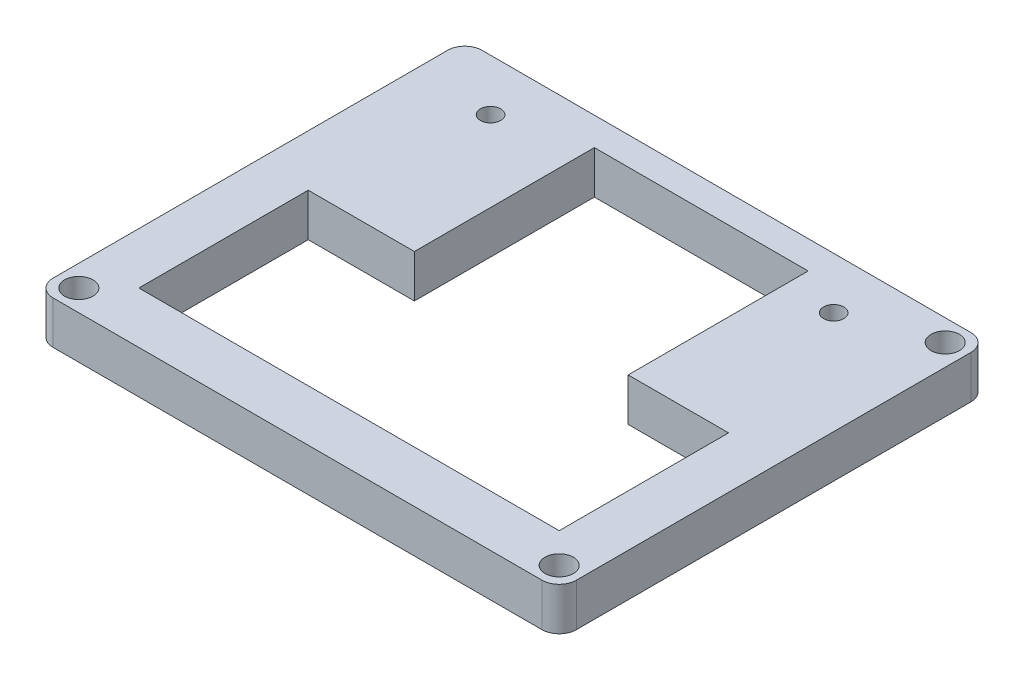
ISO-10303-21;
HEADER;
FILE_DESCRIPTION(('STEP AP214'),'2;1');
FILE_NAME('part.step','',(''),(''),'','','');
FILE_SCHEMA(('AUTOMOTIVE_DESIGN { 1 0 10303 214 1 1 1 1 }'));
ENDSEC;
DATA;
#1=APPLICATION_CONTEXT('core data for automotive mechanical design processes');
#2=APPLICATION_PROTOCOL_DEFINITION('international standard','automotive_design',2000,#1);
#3=PRODUCT_CONTEXT('',#1,'mechanical');
#4=PRODUCT('Part','Part','',(#3));
#5=PRODUCT_RELATED_PRODUCT_CATEGORY('part','',(#4));
#6=PRODUCT_DEFINITION_FORMATION('','',#4);
#7=PRODUCT_DEFINITION_CONTEXT('part definition',#1,'design');
#8=PRODUCT_DEFINITION('design','',#6,#7);
#9=PRODUCT_DEFINITION_SHAPE('','',#8);
#10=(LENGTH_UNIT() NAMED_UNIT(*) SI_UNIT(.MILLI.,.METRE.));
#11=(NAMED_UNIT(*) PLANE_ANGLE_UNIT() SI_UNIT($,.RADIAN.));
#12=(NAMED_UNIT(*) SI_UNIT($,.STERADIAN.) SOLID_ANGLE_UNIT());
#13=UNCERTAINTY_MEASURE_WITH_UNIT(LENGTH_MEASURE(1.E-05),#10,'distance_accuracy_value','');
#14=(GEOMETRIC_REPRESENTATION_CONTEXT(3) GLOBAL_UNCERTAINTY_ASSIGNED_CONTEXT((#13)) GLOBAL_UNIT_ASSIGNED_CONTEXT((#10,
#11,#12)) REPRESENTATION_CONTEXT('',''));
#15=CARTESIAN_POINT('',(0.,0.,0.));
#16=DIRECTION('',(0.,0.,1.));
#17=DIRECTION('',(1.,0.,0.));
#18=AXIS2_PLACEMENT_3D('',#15,#16,#17);
#19=CARTESIAN_POINT('',(0.,6.35,-32.6975405769432));
#20=DIRECTION('',(0.,0.,-1.));
#21=DIRECTION('',(-1.,0.,0.));
#22=AXIS2_PLACEMENT_3D('',#19,#20,#21);
#23=PLANE('',#22);
#24=DIRECTION('',(1.,0.,0.));
#25=VECTOR('',#24,1.);
#26=CARTESIAN_POINT('',(0.,0.,-32.6975405769432));
#27=LINE('',#26,#25);
#28=CARTESIAN_POINT('',(54.9824206554843,0.,-32.6975405769432));
#29=VERTEX_POINT('',#28);
#30=CARTESIAN_POINT('',(69.85,0.,-32.6975405769432));
#31=VERTEX_POINT('',#30);
#32=EDGE_CURVE('E190',#29,#31,#27,.T.);
#33=ORIENTED_EDGE('',*,*,#32,.T.);
#34=DIRECTION('',(0.,-1.,0.));
#35=VECTOR('',#34,1.);
#36=CARTESIAN_POINT('',(69.85,6.35,-32.6975405769432));
#37=LINE('',#36,#35);
#38=CARTESIAN_POINT('',(69.85,6.35,-32.6975405769432));
#39=VERTEX_POINT('',#38);
#40=EDGE_CURVE('E168',#39,#31,#37,.T.);
#41=ORIENTED_EDGE('',*,*,#40,.F.);
#42=DIRECTION('',(1.,0.,0.));
#43=VECTOR('',#42,1.);
#44=CARTESIAN_POINT('',(0.,6.35,-32.6975405769432));
#45=LINE('',#44,#43);
#46=CARTESIAN_POINT('',(54.9824206554843,6.35,-32.6975405769432));
#47=VERTEX_POINT('',#46);
#48=EDGE_CURVE('E176',#47,#39,#45,.T.);
#49=ORIENTED_EDGE('',*,*,#48,.F.);
#50=DIRECTION('',(0.,-1.,0.));
#51=VECTOR('',#50,1.);
#52=CARTESIAN_POINT('',(54.9824206554843,6.35,-32.6975405769432));
#53=LINE('',#52,#51);
#54=EDGE_CURVE('E315',#47,#29,#53,.T.);
#55=ORIENTED_EDGE('',*,*,#54,.T.);
#56=EDGE_LOOP('',(#33,#41,#49,#55));
#57=FACE_BOUND('',#56,.T.);
#58=ADVANCED_FACE('F46',(#57),#23,.F.);
#59=CARTESIAN_POINT('',(69.85,6.35,0.));
#60=DIRECTION('',(1.,0.,0.));
#61=DIRECTION('',(0.,0.,-1.));
#62=AXIS2_PLACEMENT_3D('',#59,#60,#61);
#63=PLANE('',#62);
#64=DIRECTION('',(0.,0.,1.));
#65=VECTOR('',#64,1.);
#66=CARTESIAN_POINT('',(69.85,0.,0.));
#67=LINE('',#66,#65);
#68=CARTESIAN_POINT('',(69.85,0.,-7.62));
#69=VERTEX_POINT('',#68);
#70=EDGE_CURVE('E332',#31,#69,#67,.T.);
#71=ORIENTED_EDGE('',*,*,#70,.T.);
#72=DIRECTION('',(0.,-1.,0.));
#73=VECTOR('',#72,1.);
#74=CARTESIAN_POINT('',(69.85,6.35,-7.62));
#75=LINE('',#74,#73);
#76=CARTESIAN_POINT('',(69.85,6.35,-7.62));
#77=VERTEX_POINT('',#76);
#78=EDGE_CURVE('E170',#77,#69,#75,.T.);
#79=ORIENTED_EDGE('',*,*,#78,.F.);
#80=DIRECTION('',(0.,0.,1.));
#81=VECTOR('',#80,1.);
#82=CARTESIAN_POINT('',(69.85,6.35,0.));
#83=LINE('',#82,#81);
#84=EDGE_CURVE('E163',#39,#77,#83,.T.);
#85=ORIENTED_EDGE('',*,*,#84,.F.);
#86=ORIENTED_EDGE('',*,*,#40,.T.);
#87=EDGE_LOOP('',(#71,#79,#85,#86));
#88=FACE_BOUND('',#87,.T.);
#89=ADVANCED_FACE('F166',(#88),#63,.F.);
#90=CARTESIAN_POINT('',(0.,6.35,-7.62));
#91=DIRECTION('',(0.,0.,-1.));
#92=DIRECTION('',(-1.,0.,0.));
#93=AXIS2_PLACEMENT_3D('',#90,#91,#92);
#94=PLANE('',#93);
#95=DIRECTION('',(1.,0.,0.));
#96=VECTOR('',#95,1.);
#97=CARTESIAN_POINT('',(0.,0.,-7.62));
#98=LINE('',#97,#96);
#99=CARTESIAN_POINT('',(7.62,0.,-7.62));
#100=VERTEX_POINT('',#99);
#101=EDGE_CURVE('E336',#100,#69,#98,.T.);
#102=ORIENTED_EDGE('',*,*,#101,.F.);
#103=DIRECTION('',(0.,-1.,0.));
#104=VECTOR('',#103,1.);
#105=CARTESIAN_POINT('',(7.62,6.35,-7.62));
#106=LINE('',#105,#104);
#107=CARTESIAN_POINT('',(7.62,6.35,-7.62));
#108=VERTEX_POINT('',#107);
#109=EDGE_CURVE('E198',#108,#100,#106,.T.);
#110=ORIENTED_EDGE('',*,*,#109,.F.);
#111=DIRECTION('',(1.,0.,0.));
#112=VECTOR('',#111,1.);
#113=CARTESIAN_POINT('',(0.,6.35,-7.62));
#114=LINE('',#113,#112);
#115=EDGE_CURVE('E175',#108,#77,#114,.T.);
#116=ORIENTED_EDGE('',*,*,#115,.T.);
#117=ORIENTED_EDGE('',*,*,#78,.T.);
#118=EDGE_LOOP('',(#102,#110,#116,#117));
#119=FACE_BOUND('',#118,.T.);
#120=ADVANCED_FACE('F374',(#119),#94,.T.);
#121=CARTESIAN_POINT('',(7.62,6.35,0.));
#122=DIRECTION('',(1.,0.,0.));
#123=DIRECTION('',(0.,0.,-1.));
#124=AXIS2_PLACEMENT_3D('',#121,#122,#123);
#125=PLANE('',#124);
#126=DIRECTION('',(0.,0.,1.));
#127=VECTOR('',#126,1.);
#128=CARTESIAN_POINT('',(7.62,0.,0.));
#129=LINE('',#128,#127);
#130=CARTESIAN_POINT('',(7.62,0.,-32.6975405769432));
#131=VERTEX_POINT('',#130);
#132=EDGE_CURVE('E340',#131,#100,#129,.T.);
#133=ORIENTED_EDGE('',*,*,#132,.F.);
#134=DIRECTION('',(0.,-1.,0.));
#135=VECTOR('',#134,1.);
#136=CARTESIAN_POINT('',(7.62,6.35,-32.6975405769432));
#137=LINE('',#136,#135);
#138=CARTESIAN_POINT('',(7.62,6.35,-32.6975405769432));
#139=VERTEX_POINT('',#138);
#140=EDGE_CURVE('E365',#139,#131,#137,.T.);
#141=ORIENTED_EDGE('',*,*,#140,.F.);
#142=DIRECTION('',(0.,0.,1.));
#143=VECTOR('',#142,1.);
#144=CARTESIAN_POINT('',(7.62,6.35,0.));
#145=LINE('',#144,#143);
#146=EDGE_CURVE('E302',#139,#108,#145,.T.);
#147=ORIENTED_EDGE('',*,*,#146,.T.);
#148=ORIENTED_EDGE('',*,*,#109,.T.);
#149=EDGE_LOOP('',(#133,#141,#147,#148));
#150=FACE_BOUND('',#149,.T.);
#151=ADVANCED_FACE('F371',(#150),#125,.T.);
#152=CARTESIAN_POINT('',(23.3376134601968,0.,-32.6975405769432));
#153=VERTEX_POINT('',#152);
#154=EDGE_CURVE('E333',#131,#153,#27,.T.);
#155=ORIENTED_EDGE('',*,*,#154,.T.);
#156=DIRECTION('',(0.,-1.,0.));
#157=VECTOR('',#156,1.);
#158=CARTESIAN_POINT('',(23.3376134601968,6.35,-32.6975405769432));
#159=LINE('',#158,#157);
#160=CARTESIAN_POINT('',(23.3376134601968,6.35,-32.6975405769432));
#161=VERTEX_POINT('',#160);
#162=EDGE_CURVE('E362',#161,#153,#159,.T.);
#163=ORIENTED_EDGE('',*,*,#162,.F.);
#164=EDGE_CURVE('E188',#139,#161,#45,.T.);
#165=ORIENTED_EDGE('',*,*,#164,.F.);
#166=ORIENTED_EDGE('',*,*,#140,.T.);
#167=EDGE_LOOP('',(#155,#163,#165,#166));
#168=FACE_BOUND('',#167,.T.);
#169=ADVANCED_FACE('F387',(#168),#23,.F.);
#170=CARTESIAN_POINT('',(23.3376134601968,6.35,0.));
#171=DIRECTION('',(1.,0.,0.));
#172=DIRECTION('',(0.,0.,-1.));
#173=AXIS2_PLACEMENT_3D('',#170,#171,#172);
#174=PLANE('',#173);
#175=DIRECTION('',(0.,0.,1.));
#176=VECTOR('',#175,1.);
#177=CARTESIAN_POINT('',(23.3376134601968,0.,0.));
#178=LINE('',#177,#176);
#179=CARTESIAN_POINT('',(23.3376134601968,0.,-59.3441247545589));
#180=VERTEX_POINT('',#179);
#181=EDGE_CURVE('E344',#180,#153,#178,.T.);
#182=ORIENTED_EDGE('',*,*,#181,.F.);
#183=DIRECTION('',(0.,-1.,0.));
#184=VECTOR('',#183,1.);
#185=CARTESIAN_POINT('',(23.3376134601968,6.35,-59.3441247545589));
#186=LINE('',#185,#184);
#187=CARTESIAN_POINT('',(23.3376134601968,6.35,-59.3441247545589));
#188=VERTEX_POINT('',#187);
#189=EDGE_CURVE('E359',#188,#180,#186,.T.);
#190=ORIENTED_EDGE('',*,*,#189,.F.);
#191=DIRECTION('',(0.,0.,1.));
#192=VECTOR('',#191,1.);
#193=CARTESIAN_POINT('',(23.3376134601968,6.35,0.));
#194=LINE('',#193,#192);
#195=EDGE_CURVE('E306',#188,#161,#194,.T.);
#196=ORIENTED_EDGE('',*,*,#195,.T.);
#197=ORIENTED_EDGE('',*,*,#162,.T.);
#198=EDGE_LOOP('',(#182,#190,#196,#197));
#199=FACE_BOUND('',#198,.T.);
#200=ADVANCED_FACE('F389',(#199),#174,.T.);
#201=CARTESIAN_POINT('',(0.,6.35,-59.3441247545589));
#202=DIRECTION('',(0.,0.,-1.));
#203=DIRECTION('',(-1.,0.,0.));
#204=AXIS2_PLACEMENT_3D('',#201,#202,#203);
#205=PLANE('',#204);
#206=DIRECTION('',(1.,0.,0.));
#207=VECTOR('',#206,1.);
#208=CARTESIAN_POINT('',(0.,0.,-59.3441247545589));
#209=LINE('',#208,#207);
#210=CARTESIAN_POINT('',(54.9824206554843,0.,-59.3441247545589));
#211=VERTEX_POINT('',#210);
#212=EDGE_CURVE('E348',#180,#211,#209,.T.);
#213=ORIENTED_EDGE('',*,*,#212,.T.);
#214=DIRECTION('',(0.,-1.,0.));
#215=VECTOR('',#214,1.);
#216=CARTESIAN_POINT('',(54.9824206554843,6.35,-59.3441247545589));
#217=LINE('',#216,#215);
#218=CARTESIAN_POINT('',(54.9824206554843,6.35,-59.3441247545589));
#219=VERTEX_POINT('',#218);
#220=EDGE_CURVE('E355',#219,#211,#217,.T.);
#221=ORIENTED_EDGE('',*,*,#220,.F.);
#222=DIRECTION('',(1.,0.,0.));
#223=VECTOR('',#222,1.);
#224=CARTESIAN_POINT('',(0.,6.35,-59.3441247545589));
#225=LINE('',#224,#223);
#226=EDGE_CURVE('E310',#188,#219,#225,.T.);
#227=ORIENTED_EDGE('',*,*,#226,.F.);
#228=ORIENTED_EDGE('',*,*,#189,.T.);
#229=EDGE_LOOP('',(#213,#221,#227,#228));
#230=FACE_BOUND('',#229,.T.);
#231=ADVANCED_FACE('F393',(#230),#205,.F.);
#232=CARTESIAN_POINT('',(0.,6.35,0.));
#233=DIRECTION('',(0.,0.,-1.));
#234=DIRECTION('',(-1.,0.,0.));
#235=AXIS2_PLACEMENT_3D('',#232,#233,#234);
#236=PLANE('',#235);
#237=DIRECTION('',(1.,0.,0.));
#238=VECTOR('',#237,1.);
#239=CARTESIAN_POINT('',(0.,0.,0.));
#240=LINE('',#239,#238);
#241=CARTESIAN_POINT('',(2.54,0.,0.));
#242=VERTEX_POINT('',#241);
#243=CARTESIAN_POINT('',(74.93,0.,0.));
#244=VERTEX_POINT('',#243);
#245=EDGE_CURVE('E266',#242,#244,#240,.T.);
#246=ORIENTED_EDGE('',*,*,#245,.T.);
#247=DIRECTION('',(0.,-1.,0.));
#248=VECTOR('',#247,1.);
#249=CARTESIAN_POINT('',(74.93,6.35,0.));
#250=LINE('',#249,#248);
#251=CARTESIAN_POINT('',(74.93,6.35,0.));
#252=VERTEX_POINT('',#251);
#253=EDGE_CURVE('E11',#244,#252,#250,.F.);
#254=ORIENTED_EDGE('',*,*,#253,.T.);
#255=DIRECTION('',(1.,0.,0.));
#256=VECTOR('',#255,1.);
#257=CARTESIAN_POINT('',(0.,6.35,0.));
#258=LINE('',#257,#256);
#259=CARTESIAN_POINT('',(2.54,6.35,0.));
#260=VERTEX_POINT('',#259);
#261=EDGE_CURVE('E286',#260,#252,#258,.T.);
#262=ORIENTED_EDGE('',*,*,#261,.F.);
#263=DIRECTION('',(0.,-1.,0.));
#264=VECTOR('',#263,1.);
#265=CARTESIAN_POINT('',(2.54,0.,0.));
#266=LINE('',#265,#264);
#267=EDGE_CURVE('E56',#260,#242,#266,.T.);
#268=ORIENTED_EDGE('',*,*,#267,.T.);
#269=EDGE_LOOP('',(#246,#254,#262,#268));
#270=FACE_BOUND('',#269,.T.);
#271=ADVANCED_FACE('F437',(#270),#236,.F.);
#272=CARTESIAN_POINT('',(77.47,6.35,0.));
#273=DIRECTION('',(-1.,0.,0.));
#274=DIRECTION('',(0.,0.,1.));
#275=AXIS2_PLACEMENT_3D('',#272,#273,#274);
#276=PLANE('',#275);
#277=DIRECTION('',(0.,0.,-1.));
#278=VECTOR('',#277,1.);
#279=CARTESIAN_POINT('',(77.47,0.,0.));
#280=LINE('',#279,#278);
#281=CARTESIAN_POINT('',(77.47,0.,-2.54));
#282=VERTEX_POINT('',#281);
#283=CARTESIAN_POINT('',(77.47,0.,-60.96));
#284=VERTEX_POINT('',#283);
#285=EDGE_CURVE('E319',#282,#284,#280,.T.);
#286=ORIENTED_EDGE('',*,*,#285,.T.);
#287=DIRECTION('',(0.,-1.,0.));
#288=VECTOR('',#287,1.);
#289=CARTESIAN_POINT('',(77.47,6.35,-60.96));
#290=LINE('',#289,#288);
#291=CARTESIAN_POINT('',(77.47,6.35,-60.96));
#292=VERTEX_POINT('',#291);
#293=EDGE_CURVE('E64',#284,#292,#290,.F.);
#294=ORIENTED_EDGE('',*,*,#293,.T.);
#295=DIRECTION('',(0.,0.,-1.));
#296=VECTOR('',#295,1.);
#297=CARTESIAN_POINT('',(77.47,6.35,0.));
#298=LINE('',#297,#296);
#299=CARTESIAN_POINT('',(77.47,6.35,-2.54));
#300=VERTEX_POINT('',#299);
#301=EDGE_CURVE('E289',#300,#292,#298,.T.);
#302=ORIENTED_EDGE('',*,*,#301,.F.);
#303=DIRECTION('',(0.,-1.,0.));
#304=VECTOR('',#303,1.);
#305=CARTESIAN_POINT('',(77.47,6.35,-2.54));
#306=LINE('',#305,#304);
#307=EDGE_CURVE('E235',#300,#282,#306,.T.);
#308=ORIENTED_EDGE('',*,*,#307,.T.);
#309=EDGE_LOOP('',(#286,#294,#302,#308));
#310=FACE_BOUND('',#309,.T.);
#311=ADVANCED_FACE('F433',(#310),#276,.F.);
#312=CARTESIAN_POINT('',(0.,6.35,-63.5));
#313=DIRECTION('',(0.,0.,-1.));
#314=DIRECTION('',(-1.,0.,0.));
#315=AXIS2_PLACEMENT_3D('',#312,#313,#314);
#316=PLANE('',#315);
#317=DIRECTION('',(1.,0.,0.));
#318=VECTOR('',#317,1.);
#319=CARTESIAN_POINT('',(0.,0.,-63.5));
#320=LINE('',#319,#318);
#321=CARTESIAN_POINT('',(2.54,0.,-63.5));
#322=VERTEX_POINT('',#321);
#323=CARTESIAN_POINT('',(74.93,0.,-63.5));
#324=VERTEX_POINT('',#323);
#325=EDGE_CURVE('E322',#322,#324,#320,.T.);
#326=ORIENTED_EDGE('',*,*,#325,.F.);
#327=DIRECTION('',(0.,-1.,0.));
#328=VECTOR('',#327,1.);
#329=CARTESIAN_POINT('',(2.54,6.35,-63.5));
#330=LINE('',#329,#328);
#331=CARTESIAN_POINT('',(2.54,6.35,-63.5));
#332=VERTEX_POINT('',#331);
#333=EDGE_CURVE('E221',#322,#332,#330,.F.);
#334=ORIENTED_EDGE('',*,*,#333,.T.);
#335=DIRECTION('',(1.,0.,0.));
#336=VECTOR('',#335,1.);
#337=CARTESIAN_POINT('',(0.,6.35,-63.5));
#338=LINE('',#337,#336);
#339=CARTESIAN_POINT('',(74.93,6.35,-63.5));
#340=VERTEX_POINT('',#339);
#341=EDGE_CURVE('E293',#332,#340,#338,.T.);
#342=ORIENTED_EDGE('',*,*,#341,.T.);
#343=DIRECTION('',(0.,-1.,0.));
#344=VECTOR('',#343,1.);
#345=CARTESIAN_POINT('',(74.93,0.,-63.5));
#346=LINE('',#345,#344);
#347=EDGE_CURVE('E217',#340,#324,#346,.T.);
#348=ORIENTED_EDGE('',*,*,#347,.T.);
#349=EDGE_LOOP('',(#326,#334,#342,#348));
#350=FACE_BOUND('',#349,.T.);
#351=ADVANCED_FACE('F408',(#350),#316,.T.);
#352=CARTESIAN_POINT('',(0.,6.35,0.));
#353=DIRECTION('',(-1.,0.,0.));
#354=DIRECTION('',(0.,0.,1.));
#355=AXIS2_PLACEMENT_3D('',#352,#353,#354);
#356=PLANE('',#355);
#357=DIRECTION('',(0.,0.,-1.));
#358=VECTOR('',#357,1.);
#359=CARTESIAN_POINT('',(0.,6.35,0.));
#360=LINE('',#359,#358);
#361=CARTESIAN_POINT('',(0.,6.35,-2.54));
#362=VERTEX_POINT('',#361);
#363=CARTESIAN_POINT('',(0.,6.35,-60.96));
#364=VERTEX_POINT('',#363);
#365=EDGE_CURVE('E186',#362,#364,#360,.T.);
#366=ORIENTED_EDGE('',*,*,#365,.T.);
#367=DIRECTION('',(0.,-1.,0.));
#368=VECTOR('',#367,1.);
#369=CARTESIAN_POINT('',(0.,6.35,-60.96));
#370=LINE('',#369,#368);
#371=CARTESIAN_POINT('',(0.,0.,-60.96));
#372=VERTEX_POINT('',#371);
#373=EDGE_CURVE('E196',#364,#372,#370,.T.);
#374=ORIENTED_EDGE('',*,*,#373,.T.);
#375=DIRECTION('',(0.,0.,-1.));
#376=VECTOR('',#375,1.);
#377=CARTESIAN_POINT('',(0.,0.,0.));
#378=LINE('',#377,#376);
#379=CARTESIAN_POINT('',(0.,0.,-2.54));
#380=VERTEX_POINT('',#379);
#381=EDGE_CURVE('E326',#380,#372,#378,.T.);
#382=ORIENTED_EDGE('',*,*,#381,.F.);
#383=DIRECTION('',(0.,-1.,0.));
#384=VECTOR('',#383,1.);
#385=CARTESIAN_POINT('',(0.,6.35,-2.54));
#386=LINE('',#385,#384);
#387=EDGE_CURVE('E192',#380,#362,#386,.F.);
#388=ORIENTED_EDGE('',*,*,#387,.T.);
#389=EDGE_LOOP('',(#366,#374,#382,#388));
#390=FACE_BOUND('',#389,.T.);
#391=ADVANCED_FACE('F398',(#390),#356,.T.);
#392=CARTESIAN_POINT('',(54.9824206554843,6.35,0.));
#393=DIRECTION('',(1.,0.,0.));
#394=DIRECTION('',(0.,0.,-1.));
#395=AXIS2_PLACEMENT_3D('',#392,#393,#394);
#396=PLANE('',#395);
#397=DIRECTION('',(0.,0.,1.));
#398=VECTOR('',#397,1.);
#399=CARTESIAN_POINT('',(54.9824206554843,0.,0.));
#400=LINE('',#399,#398);
#401=EDGE_CURVE('E290',#211,#29,#400,.T.);
#402=ORIENTED_EDGE('',*,*,#401,.T.);
#403=ORIENTED_EDGE('',*,*,#54,.F.);
#404=DIRECTION('',(0.,0.,1.));
#405=VECTOR('',#404,1.);
#406=CARTESIAN_POINT('',(54.9824206554843,6.35,0.));
#407=LINE('',#406,#405);
#408=EDGE_CURVE('E181',#219,#47,#407,.T.);
#409=ORIENTED_EDGE('',*,*,#408,.F.);
#410=ORIENTED_EDGE('',*,*,#220,.T.);
#411=EDGE_LOOP('',(#402,#403,#409,#410));
#412=FACE_BOUND('',#411,.T.);
#413=ADVANCED_FACE('F396',(#412),#396,.F.);
#414=CARTESIAN_POINT('',(0.,6.35,0.));
#415=DIRECTION('',(0.,1.,0.));
#416=DIRECTION('',(0.,0.,1.));
#417=AXIS2_PLACEMENT_3D('',#414,#415,#416);
#418=PLANE('',#417);
#419=CARTESIAN_POINT('',(11.43,6.35,-55.88));
#420=DIRECTION('',(0.,1.,0.));
#421=DIRECTION('',(0.,0.,1.));
#422=AXIS2_PLACEMENT_3D('',#419,#420,#421);
#423=CIRCLE('',#422,1.5);
#424=CARTESIAN_POINT('',(11.43,6.35,-54.38));
#425=VERTEX_POINT('',#424);
#426=EDGE_CURVE('E246',#425,#425,#423,.T.);
#427=ORIENTED_EDGE('',*,*,#426,.F.);
#428=EDGE_LOOP('',(#427));
#429=FACE_BOUND('',#428,.T.);
#430=CARTESIAN_POINT('',(62.23,6.35,-55.88));
#431=DIRECTION('',(0.,1.,0.));
#432=DIRECTION('',(0.,0.,1.));
#433=AXIS2_PLACEMENT_3D('',#430,#431,#432);
#434=CIRCLE('',#433,1.5);
#435=CARTESIAN_POINT('',(62.23,6.35,-54.38));
#436=VERTEX_POINT('',#435);
#437=EDGE_CURVE('E254',#436,#436,#434,.T.);
#438=ORIENTED_EDGE('',*,*,#437,.F.);
#439=EDGE_LOOP('',(#438));
#440=FACE_BOUND('',#439,.T.);
#441=CARTESIAN_POINT('',(3.175,6.35,-3.175));
#442=DIRECTION('',(0.,1.,0.));
#443=DIRECTION('',(0.,0.,1.));
#444=AXIS2_PLACEMENT_3D('',#441,#442,#443);
#445=CIRCLE('',#444,2.1);
#446=CARTESIAN_POINT('',(3.175,6.35,-1.075));
#447=VERTEX_POINT('',#446);
#448=EDGE_CURVE('E267',#447,#447,#445,.T.);
#449=ORIENTED_EDGE('',*,*,#448,.F.);
#450=EDGE_LOOP('',(#449));
#451=FACE_BOUND('',#450,.T.);
#452=CARTESIAN_POINT('',(74.295,6.35,-3.175));
#453=DIRECTION('',(0.,1.,0.));
#454=DIRECTION('',(0.,0.,1.));
#455=AXIS2_PLACEMENT_3D('',#452,#453,#454);
#456=CIRCLE('',#455,2.1);
#457=CARTESIAN_POINT('',(74.295,6.35,-1.075));
#458=VERTEX_POINT('',#457);
#459=EDGE_CURVE('E271',#458,#458,#456,.T.);
#460=ORIENTED_EDGE('',*,*,#459,.F.);
#461=EDGE_LOOP('',(#460));
#462=FACE_BOUND('',#461,.T.);
#463=CARTESIAN_POINT('',(74.295,6.35,-60.325));
#464=DIRECTION('',(0.,1.,0.));
#465=DIRECTION('',(0.,0.,1.));
#466=AXIS2_PLACEMENT_3D('',#463,#464,#465);
#467=CIRCLE('',#466,2.09999999999999);
#468=CARTESIAN_POINT('',(74.295,6.35,-58.225));
#469=VERTEX_POINT('',#468);
#470=EDGE_CURVE('E279',#469,#469,#467,.T.);
#471=ORIENTED_EDGE('',*,*,#470,.F.);
#472=EDGE_LOOP('',(#471));
#473=FACE_BOUND('',#472,.T.);
#474=ORIENTED_EDGE('',*,*,#341,.F.);
#475=CARTESIAN_POINT('',(2.54,6.35,-60.96));
#476=DIRECTION('',(0.,1.,0.));
#477=DIRECTION('',(0.,0.,1.));
#478=AXIS2_PLACEMENT_3D('',#475,#476,#477);
#479=CIRCLE('',#478,2.54);
#480=EDGE_CURVE('E232',#332,#364,#479,.T.);
#481=ORIENTED_EDGE('',*,*,#480,.T.);
#482=ORIENTED_EDGE('',*,*,#365,.F.);
#483=CARTESIAN_POINT('',(2.54,6.35,-2.54));
#484=DIRECTION('',(0.,1.,0.));
#485=DIRECTION('',(0.,0.,1.));
#486=AXIS2_PLACEMENT_3D('',#483,#484,#485);
#487=CIRCLE('',#486,2.54);
#488=EDGE_CURVE('E224',#362,#260,#487,.T.);
#489=ORIENTED_EDGE('',*,*,#488,.T.);
#490=ORIENTED_EDGE('',*,*,#261,.T.);
#491=CARTESIAN_POINT('',(74.93,6.35,-2.54));
#492=DIRECTION('',(0.,1.,0.));
#493=DIRECTION('',(0.,0.,1.));
#494=AXIS2_PLACEMENT_3D('',#491,#492,#493);
#495=CIRCLE('',#494,2.54);
#496=EDGE_CURVE('E71',#252,#300,#495,.T.);
#497=ORIENTED_EDGE('',*,*,#496,.T.);
#498=ORIENTED_EDGE('',*,*,#301,.T.);
#499=CARTESIAN_POINT('',(74.93,6.35,-60.96));
#500=DIRECTION('',(0.,1.,0.));
#501=DIRECTION('',(0.,0.,1.));
#502=AXIS2_PLACEMENT_3D('',#499,#500,#501);
#503=CIRCLE('',#502,2.54);
#504=EDGE_CURVE('E229',#292,#340,#503,.T.);
#505=ORIENTED_EDGE('',*,*,#504,.T.);
#506=EDGE_LOOP('',(#474,#481,#482,#489,#490,#497,#498,#505));
#507=FACE_BOUND('',#506,.T.);
#508=ORIENTED_EDGE('',*,*,#48,.T.);
#509=ORIENTED_EDGE('',*,*,#84,.T.);
#510=ORIENTED_EDGE('',*,*,#115,.F.);
#511=ORIENTED_EDGE('',*,*,#146,.F.);
#512=ORIENTED_EDGE('',*,*,#164,.T.);
#513=ORIENTED_EDGE('',*,*,#195,.F.);
#514=ORIENTED_EDGE('',*,*,#226,.T.);
#515=ORIENTED_EDGE('',*,*,#408,.T.);
#516=EDGE_LOOP('',(#508,#509,#510,#511,#512,#513,#514,#515));
#517=FACE_BOUND('',#516,.T.);
#518=ADVANCED_FACE('F179',(#429,#440,#451,#462,#473,#507,#517),#418,.T.);
#519=CARTESIAN_POINT('',(0.,0.,0.));
#520=DIRECTION('',(0.,1.,0.));
#521=DIRECTION('',(0.,0.,1.));
#522=AXIS2_PLACEMENT_3D('',#519,#520,#521);
#523=PLANE('',#522);
#524=CARTESIAN_POINT('',(11.43,0.,-55.88));
#525=DIRECTION('',(0.,1.,0.));
#526=DIRECTION('',(0.,0.,1.));
#527=AXIS2_PLACEMENT_3D('',#524,#525,#526);
#528=CIRCLE('',#527,1.5);
#529=CARTESIAN_POINT('',(11.43,0.,-54.38));
#530=VERTEX_POINT('',#529);
#531=EDGE_CURVE('E50',#530,#530,#528,.T.);
#532=ORIENTED_EDGE('',*,*,#531,.T.);
#533=EDGE_LOOP('',(#532));
#534=FACE_BOUND('',#533,.T.);
#535=CARTESIAN_POINT('',(62.23,0.,-55.88));
#536=DIRECTION('',(0.,1.,0.));
#537=DIRECTION('',(0.,0.,1.));
#538=AXIS2_PLACEMENT_3D('',#535,#536,#537);
#539=CIRCLE('',#538,1.5);
#540=CARTESIAN_POINT('',(62.23,0.,-54.38));
#541=VERTEX_POINT('',#540);
#542=EDGE_CURVE('E243',#541,#541,#539,.T.);
#543=ORIENTED_EDGE('',*,*,#542,.T.);
#544=EDGE_LOOP('',(#543));
#545=FACE_BOUND('',#544,.T.);
#546=CARTESIAN_POINT('',(3.175,0.,-3.175));
#547=DIRECTION('',(0.,1.,0.));
#548=DIRECTION('',(0.,0.,1.));
#549=AXIS2_PLACEMENT_3D('',#546,#547,#548);
#550=CIRCLE('',#549,2.1);
#551=CARTESIAN_POINT('',(3.175,0.,-1.075));
#552=VERTEX_POINT('',#551);
#553=EDGE_CURVE('E262',#552,#552,#550,.T.);
#554=ORIENTED_EDGE('',*,*,#553,.T.);
#555=EDGE_LOOP('',(#554));
#556=FACE_BOUND('',#555,.T.);
#557=CARTESIAN_POINT('',(74.295,0.,-3.175));
#558=DIRECTION('',(0.,1.,0.));
#559=DIRECTION('',(0.,0.,1.));
#560=AXIS2_PLACEMENT_3D('',#557,#558,#559);
#561=CIRCLE('',#560,2.1);
#562=CARTESIAN_POINT('',(74.295,0.,-1.075));
#563=VERTEX_POINT('',#562);
#564=EDGE_CURVE('E275',#563,#563,#561,.T.);
#565=ORIENTED_EDGE('',*,*,#564,.T.);
#566=EDGE_LOOP('',(#565));
#567=FACE_BOUND('',#566,.T.);
#568=CARTESIAN_POINT('',(74.295,0.,-60.325));
#569=DIRECTION('',(0.,1.,0.));
#570=DIRECTION('',(0.,0.,1.));
#571=AXIS2_PLACEMENT_3D('',#568,#569,#570);
#572=CIRCLE('',#571,2.09999999999999);
#573=CARTESIAN_POINT('',(74.295,0.,-58.225));
#574=VERTEX_POINT('',#573);
#575=EDGE_CURVE('E252',#574,#574,#572,.T.);
#576=ORIENTED_EDGE('',*,*,#575,.T.);
#577=EDGE_LOOP('',(#576));
#578=FACE_BOUND('',#577,.T.);
#579=ORIENTED_EDGE('',*,*,#381,.T.);
#580=CARTESIAN_POINT('',(2.54,0.,-60.96));
#581=DIRECTION('',(0.,1.,0.));
#582=DIRECTION('',(0.,0.,1.));
#583=AXIS2_PLACEMENT_3D('',#580,#581,#582);
#584=CIRCLE('',#583,2.54);
#585=EDGE_CURVE('E214',#372,#322,#584,.F.);
#586=ORIENTED_EDGE('',*,*,#585,.T.);
#587=ORIENTED_EDGE('',*,*,#325,.T.);
#588=CARTESIAN_POINT('',(74.93,0.,-60.96));
#589=DIRECTION('',(0.,1.,0.));
#590=DIRECTION('',(0.,0.,1.));
#591=AXIS2_PLACEMENT_3D('',#588,#589,#590);
#592=CIRCLE('',#591,2.54);
#593=EDGE_CURVE('E211',#324,#284,#592,.F.);
#594=ORIENTED_EDGE('',*,*,#593,.T.);
#595=ORIENTED_EDGE('',*,*,#285,.F.);
#596=CARTESIAN_POINT('',(74.93,0.,-2.54));
#597=DIRECTION('',(0.,1.,0.));
#598=DIRECTION('',(0.,0.,1.));
#599=AXIS2_PLACEMENT_3D('',#596,#597,#598);
#600=CIRCLE('',#599,2.54);
#601=EDGE_CURVE('E208',#282,#244,#600,.F.);
#602=ORIENTED_EDGE('',*,*,#601,.T.);
#603=ORIENTED_EDGE('',*,*,#245,.F.);
#604=CARTESIAN_POINT('',(2.54,0.,-2.54));
#605=DIRECTION('',(0.,1.,0.));
#606=DIRECTION('',(0.,0.,1.));
#607=AXIS2_PLACEMENT_3D('',#604,#605,#606);
#608=CIRCLE('',#607,2.54);
#609=EDGE_CURVE('E205',#242,#380,#608,.F.);
#610=ORIENTED_EDGE('',*,*,#609,.T.);
#611=EDGE_LOOP('',(#579,#586,#587,#594,#595,#602,#603,#610));
#612=FACE_BOUND('',#611,.T.);
#613=ORIENTED_EDGE('',*,*,#32,.F.);
#614=ORIENTED_EDGE('',*,*,#401,.F.);
#615=ORIENTED_EDGE('',*,*,#212,.F.);
#616=ORIENTED_EDGE('',*,*,#181,.T.);
#617=ORIENTED_EDGE('',*,*,#154,.F.);
#618=ORIENTED_EDGE('',*,*,#132,.T.);
#619=ORIENTED_EDGE('',*,*,#101,.T.);
#620=ORIENTED_EDGE('',*,*,#70,.F.);
#621=EDGE_LOOP('',(#613,#614,#615,#616,#617,#618,#619,#620));
#622=FACE_BOUND('',#621,.T.);
#623=ADVANCED_FACE('F377',(#534,#545,#556,#567,#578,#612,#622),#523,.F.);
#624=CARTESIAN_POINT('',(74.295,0.,-60.325));
#625=DIRECTION('',(0.,1.,0.));
#626=DIRECTION('',(0.,0.,1.));
#627=AXIS2_PLACEMENT_3D('',#624,#625,#626);
#628=CYLINDRICAL_SURFACE('',#627,2.09999999999999);
#629=ORIENTED_EDGE('',*,*,#575,.F.);
#630=EDGE_LOOP('',(#629));
#631=FACE_BOUND('',#630,.T.);
#632=ORIENTED_EDGE('',*,*,#470,.T.);
#633=EDGE_LOOP('',(#632));
#634=FACE_BOUND('',#633,.T.);
#635=ADVANCED_FACE('F476',(#631,#634),#628,.F.);
#636=CARTESIAN_POINT('',(74.295,0.,-3.175));
#637=DIRECTION('',(0.,1.,0.));
#638=DIRECTION('',(0.,0.,1.));
#639=AXIS2_PLACEMENT_3D('',#636,#637,#638);
#640=CYLINDRICAL_SURFACE('',#639,2.1);
#641=ORIENTED_EDGE('',*,*,#564,.F.);
#642=EDGE_LOOP('',(#641));
#643=FACE_BOUND('',#642,.T.);
#644=ORIENTED_EDGE('',*,*,#459,.T.);
#645=EDGE_LOOP('',(#644));
#646=FACE_BOUND('',#645,.T.);
#647=ADVANCED_FACE('F481',(#643,#646),#640,.F.);
#648=CARTESIAN_POINT('',(3.175,0.,-3.175));
#649=DIRECTION('',(0.,1.,0.));
#650=DIRECTION('',(0.,0.,1.));
#651=AXIS2_PLACEMENT_3D('',#648,#649,#650);
#652=CYLINDRICAL_SURFACE('',#651,2.1);
#653=ORIENTED_EDGE('',*,*,#553,.F.);
#654=EDGE_LOOP('',(#653));
#655=FACE_BOUND('',#654,.T.);
#656=ORIENTED_EDGE('',*,*,#448,.T.);
#657=EDGE_LOOP('',(#656));
#658=FACE_BOUND('',#657,.T.);
#659=ADVANCED_FACE('F445',(#655,#658),#652,.F.);
#660=CARTESIAN_POINT('',(2.54,6.35,-60.96));
#661=DIRECTION('',(0.,-1.,0.));
#662=DIRECTION('',(0.,0.,-1.));
#663=AXIS2_PLACEMENT_3D('',#660,#661,#662);
#664=CYLINDRICAL_SURFACE('',#663,2.54);
#665=ORIENTED_EDGE('',*,*,#480,.F.);
#666=ORIENTED_EDGE('',*,*,#333,.F.);
#667=ORIENTED_EDGE('',*,*,#585,.F.);
#668=ORIENTED_EDGE('',*,*,#373,.F.);
#669=EDGE_LOOP('',(#665,#666,#667,#668));
#670=FACE_BOUND('',#669,.T.);
#671=ADVANCED_FACE('F441',(#670),#664,.T.);
#672=CARTESIAN_POINT('',(74.93,6.35,-60.96));
#673=DIRECTION('',(0.,1.,0.));
#674=DIRECTION('',(0.,0.,1.));
#675=AXIS2_PLACEMENT_3D('',#672,#673,#674);
#676=CYLINDRICAL_SURFACE('',#675,2.54);
#677=ORIENTED_EDGE('',*,*,#504,.F.);
#678=ORIENTED_EDGE('',*,*,#293,.F.);
#679=ORIENTED_EDGE('',*,*,#593,.F.);
#680=ORIENTED_EDGE('',*,*,#347,.F.);
#681=EDGE_LOOP('',(#677,#678,#679,#680));
#682=FACE_BOUND('',#681,.T.);
#683=ADVANCED_FACE('F444',(#682),#676,.T.);
#684=CARTESIAN_POINT('',(74.93,6.35,-2.54));
#685=DIRECTION('',(0.,-1.,0.));
#686=DIRECTION('',(0.,0.,-1.));
#687=AXIS2_PLACEMENT_3D('',#684,#685,#686);
#688=CYLINDRICAL_SURFACE('',#687,2.54);
#689=ORIENTED_EDGE('',*,*,#496,.F.);
#690=ORIENTED_EDGE('',*,*,#253,.F.);
#691=ORIENTED_EDGE('',*,*,#601,.F.);
#692=ORIENTED_EDGE('',*,*,#307,.F.);
#693=EDGE_LOOP('',(#689,#690,#691,#692));
#694=FACE_BOUND('',#693,.T.);
#695=ADVANCED_FACE('F448',(#694),#688,.T.);
#696=CARTESIAN_POINT('',(2.54,6.35,-2.54));
#697=DIRECTION('',(0.,1.,0.));
#698=DIRECTION('',(0.,0.,1.));
#699=AXIS2_PLACEMENT_3D('',#696,#697,#698);
#700=CYLINDRICAL_SURFACE('',#699,2.54);
#701=ORIENTED_EDGE('',*,*,#488,.F.);
#702=ORIENTED_EDGE('',*,*,#387,.F.);
#703=ORIENTED_EDGE('',*,*,#609,.F.);
#704=ORIENTED_EDGE('',*,*,#267,.F.);
#705=EDGE_LOOP('',(#701,#702,#703,#704));
#706=FACE_BOUND('',#705,.T.);
#707=ADVANCED_FACE('F48',(#706),#700,.T.);
#708=CARTESIAN_POINT('',(62.23,-3.81,-55.88));
#709=DIRECTION('',(0.,1.,0.));
#710=DIRECTION('',(0.,0.,1.));
#711=AXIS2_PLACEMENT_3D('',#708,#709,#710);
#712=CYLINDRICAL_SURFACE('',#711,1.5);
#713=ORIENTED_EDGE('',*,*,#437,.T.);
#714=EDGE_LOOP('',(#713));
#715=FACE_BOUND('',#714,.T.);
#716=ORIENTED_EDGE('',*,*,#542,.F.);
#717=EDGE_LOOP('',(#716));
#718=FACE_BOUND('',#717,.T.);
#719=ADVANCED_FACE('F455',(#715,#718),#712,.F.);
#720=CARTESIAN_POINT('',(11.43,-3.81,-55.88));
#721=DIRECTION('',(0.,1.,0.));
#722=DIRECTION('',(0.,0.,1.));
#723=AXIS2_PLACEMENT_3D('',#720,#721,#722);
#724=CYLINDRICAL_SURFACE('',#723,1.5);
#725=ORIENTED_EDGE('',*,*,#426,.T.);
#726=EDGE_LOOP('',(#725));
#727=FACE_BOUND('',#726,.T.);
#728=ORIENTED_EDGE('',*,*,#531,.F.);
#729=EDGE_LOOP('',(#728));
#730=FACE_BOUND('',#729,.T.);
#731=ADVANCED_FACE('F492',(#727,#730),#724,.F.);
#732=CLOSED_SHELL('',(#58,#89,#120,#151,#169,#200,#231,#271,#311,#351,#391,#413,#518,#623,#635,
#647,#659,#671,#683,#695,#707,#719,#731));
#733=MANIFOLD_SOLID_BREP('B2',#732);
#734=ADVANCED_BREP_SHAPE_REPRESENTATION('',(#18,#733),#14);
#735=SHAPE_DEFINITION_REPRESENTATION(#9,#734);
ENDSEC;
END-ISO-10303-21;
